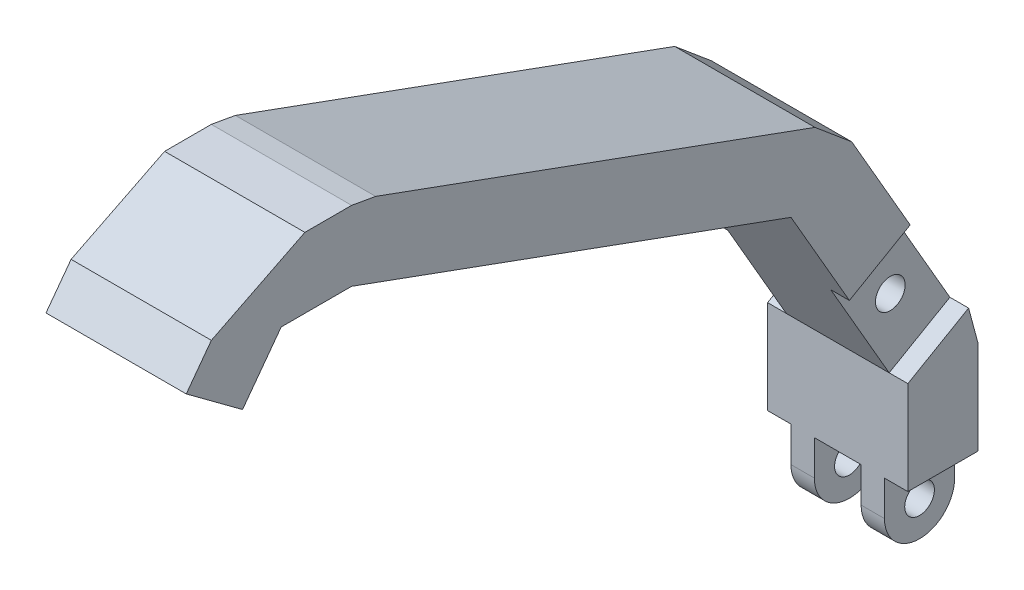
ISO-10303-21;
HEADER;
FILE_DESCRIPTION(('STEP AP214'),'2;1');
FILE_NAME('part.step','',(''),(''),'','','');
FILE_SCHEMA(('AUTOMOTIVE_DESIGN { 1 0 10303 214 1 1 1 1 }'));
ENDSEC;
DATA;
#1=APPLICATION_CONTEXT('core data for automotive mechanical design processes');
#2=APPLICATION_PROTOCOL_DEFINITION('international standard','automotive_design',2000,#1);
#3=PRODUCT_CONTEXT('',#1,'mechanical');
#4=PRODUCT('Part','Part','',(#3));
#5=PRODUCT_RELATED_PRODUCT_CATEGORY('part','',(#4));
#6=PRODUCT_DEFINITION_FORMATION('','',#4);
#7=PRODUCT_DEFINITION_CONTEXT('part definition',#1,'design');
#8=PRODUCT_DEFINITION('design','',#6,#7);
#9=PRODUCT_DEFINITION_SHAPE('','',#8);
#10=(LENGTH_UNIT() NAMED_UNIT(*) SI_UNIT(.MILLI.,.METRE.));
#11=(NAMED_UNIT(*) PLANE_ANGLE_UNIT() SI_UNIT($,.RADIAN.));
#12=(NAMED_UNIT(*) SI_UNIT($,.STERADIAN.) SOLID_ANGLE_UNIT());
#13=UNCERTAINTY_MEASURE_WITH_UNIT(LENGTH_MEASURE(1.E-05),#10,'distance_accuracy_value','');
#14=(GEOMETRIC_REPRESENTATION_CONTEXT(3) GLOBAL_UNCERTAINTY_ASSIGNED_CONTEXT((#13)) GLOBAL_UNIT_ASSIGNED_CONTEXT((#10,
#11,#12)) REPRESENTATION_CONTEXT('',''));
#15=CARTESIAN_POINT('',(0.,0.,0.));
#16=DIRECTION('',(0.,0.,1.));
#17=DIRECTION('',(1.,0.,0.));
#18=AXIS2_PLACEMENT_3D('',#15,#16,#17);
#19=CARTESIAN_POINT('',(0.,0.,-20.));
#20=DIRECTION('',(1.,0.,0.));
#21=DIRECTION('',(0.,0.,-1.));
#22=AXIS2_PLACEMENT_3D('',#19,#20,#21);
#23=PLANE('',#22);
#24=DIRECTION('',(0.,1.,0.));
#25=VECTOR('',#24,1.);
#26=CARTESIAN_POINT('',(0.,-97.503284521789,-148.969262078591));
#27=LINE('',#26,#25);
#28=CARTESIAN_POINT('',(0.,-97.503284521789,-148.969262078591));
#29=VERTEX_POINT('',#28);
#30=CARTESIAN_POINT('',(0.,-77.503284521789,-148.969262078591));
#31=VERTEX_POINT('',#30);
#32=EDGE_CURVE('E448',#29,#31,#27,.T.);
#33=ORIENTED_EDGE('',*,*,#32,.T.);
#34=DIRECTION('',(0.,0.499999999999998,-0.86602540378444));
#35=VECTOR('',#34,1.);
#36=CARTESIAN_POINT('',(0.,-150.758878018647,-22.0868522034198));
#37=LINE('',#36,#35);
#38=CARTESIAN_POINT('',(0.,-70.003284521789,-161.959643135357));
#39=VERTEX_POINT('',#38);
#40=EDGE_CURVE('E342',#31,#39,#37,.T.);
#41=ORIENTED_EDGE('',*,*,#40,.T.);
#42=DIRECTION('',(0.,-0.965925826289068,-0.258819045102521));
#43=VECTOR('',#42,1.);
#44=CARTESIAN_POINT('',(0.,-70.003284521789,-161.959643135357));
#45=LINE('',#44,#43);
#46=CARTESIAN_POINT('',(0.,-77.503284521789,-163.969262078591));
#47=VERTEX_POINT('',#46);
#48=EDGE_CURVE('E449',#39,#47,#45,.T.);
#49=ORIENTED_EDGE('',*,*,#48,.T.);
#50=DIRECTION('',(0.,1.,0.));
#51=VECTOR('',#50,1.);
#52=CARTESIAN_POINT('',(0.,-97.503284521789,-163.969262078591));
#53=LINE('',#52,#51);
#54=CARTESIAN_POINT('',(0.,-97.503284521789,-163.969262078591));
#55=VERTEX_POINT('',#54);
#56=EDGE_CURVE('E443',#55,#47,#53,.T.);
#57=ORIENTED_EDGE('',*,*,#56,.F.);
#58=DIRECTION('',(0.,0.,-1.));
#59=VECTOR('',#58,1.);
#60=CARTESIAN_POINT('',(0.,-97.503284521789,-148.969262078591));
#61=LINE('',#60,#59);
#62=EDGE_CURVE('E433',#29,#55,#61,.T.);
#63=ORIENTED_EDGE('',*,*,#62,.F.);
#64=EDGE_LOOP('',(#33,#41,#49,#57,#63));
#65=FACE_BOUND('',#64,.T.);
#66=ADVANCED_FACE('F92',(#65),#23,.F.);
#67=CARTESIAN_POINT('',(30.,0.,-20.));
#68=DIRECTION('',(-1.,0.,0.));
#69=DIRECTION('',(0.,0.,1.));
#70=AXIS2_PLACEMENT_3D('',#67,#68,#69);
#71=PLANE('',#70);
#72=DIRECTION('',(0.,0.86602540378444,0.499999999999998));
#73=VECTOR('',#72,1.);
#74=CARTESIAN_POINT('',(30.,-77.503284521789,-148.969262078591));
#75=LINE('',#74,#73);
#76=CARTESIAN_POINT('',(30.,-55.852649427178,-136.469262078591));
#77=VERTEX_POINT('',#76);
#78=CARTESIAN_POINT('',(30.,-34.202014332567,-123.969262078591));
#79=VERTEX_POINT('',#78);
#80=EDGE_CURVE('E465',#77,#79,#75,.T.);
#81=ORIENTED_EDGE('',*,*,#80,.F.);
#82=DIRECTION('',(0.,0.499999999999998,-0.86602540378444));
#83=VECTOR('',#82,1.);
#84=CARTESIAN_POINT('',(30.,-129.108242924036,-9.58685220341982));
#85=LINE('',#84,#83);
#86=CARTESIAN_POINT('',(30.,-48.352649427178,-149.459643135357));
#87=VERTEX_POINT('',#86);
#88=EDGE_CURVE('E333',#77,#87,#85,.T.);
#89=ORIENTED_EDGE('',*,*,#88,.T.);
#90=DIRECTION('',(0.,0.86602540378444,0.499999999999998));
#91=VECTOR('',#90,1.);
#92=CARTESIAN_POINT('',(30.,-70.003284521789,-161.959643135357));
#93=LINE('',#92,#91);
#94=CARTESIAN_POINT('',(30.,-26.702014332567,-136.959643135357));
#95=VERTEX_POINT('',#94);
#96=EDGE_CURVE('E461',#87,#95,#93,.T.);
#97=ORIENTED_EDGE('',*,*,#96,.T.);
#98=DIRECTION('',(0.,-0.64278760968654,-0.766044443118978));
#99=VECTOR('',#98,1.);
#100=CARTESIAN_POINT('',(30.,-20.1066250207783,-129.099564228476));
#101=LINE('',#100,#99);
#102=CARTESIAN_POINT('',(30.,-20.1066250207783,-129.099564228476));
#103=VERTEX_POINT('',#102);
#104=EDGE_CURVE('E469',#103,#95,#101,.T.);
#105=ORIENTED_EDGE('',*,*,#104,.F.);
#106=DIRECTION('',(0.,0.342020143325669,0.939692620785908));
#107=VECTOR('',#106,1.);
#108=CARTESIAN_POINT('',(30.,-20.1066250207783,-129.099564228476));
#109=LINE('',#108,#107);
#110=CARTESIAN_POINT('',(30.,14.0953893117886,-35.130302149885));
#111=VERTEX_POINT('',#110);
#112=EDGE_CURVE('E685',#103,#111,#109,.T.);
#113=ORIENTED_EDGE('',*,*,#112,.T.);
#114=DIRECTION('',(0.,-0.173648177666931,-0.984807753012208));
#115=VECTOR('',#114,1.);
#116=CARTESIAN_POINT('',(30.,15.,-30.));
#117=LINE('',#116,#115);
#118=CARTESIAN_POINT('',(30.,15.,-30.));
#119=VERTEX_POINT('',#118);
#120=EDGE_CURVE('E486',#119,#111,#117,.T.);
#121=ORIENTED_EDGE('',*,*,#120,.F.);
#122=DIRECTION('',(0.,0.,-1.));
#123=VECTOR('',#122,1.);
#124=CARTESIAN_POINT('',(30.,15.,-20.));
#125=LINE('',#124,#123);
#126=CARTESIAN_POINT('',(30.,15.,-20.));
#127=VERTEX_POINT('',#126);
#128=EDGE_CURVE('E516',#127,#119,#125,.T.);
#129=ORIENTED_EDGE('',*,*,#128,.F.);
#130=DIRECTION('',(0.,0.447213595499958,-0.894427190999916));
#131=VECTOR('',#130,1.);
#132=CARTESIAN_POINT('',(30.,10.,-10.));
#133=LINE('',#132,#131);
#134=CARTESIAN_POINT('',(30.,5.,0.));
#135=VERTEX_POINT('',#134);
#136=EDGE_CURVE('E303',#135,#127,#133,.T.);
#137=ORIENTED_EDGE('',*,*,#136,.F.);
#138=DIRECTION('',(0.,-0.803649179325779,0.595103349485618));
#139=VECTOR('',#138,1.);
#140=CARTESIAN_POINT('',(30.,50.5288673287577,-33.7141903988017));
#141=LINE('',#140,#139);
#142=CARTESIAN_POINT('',(30.,-2.24750591378389,5.36678833956879));
#143=VERTEX_POINT('',#142);
#144=EDGE_CURVE('E299',#135,#143,#141,.T.);
#145=ORIENTED_EDGE('',*,*,#144,.T.);
#146=DIRECTION('',(0.,0.595103349485618,0.803649179325779));
#147=VECTOR('',#146,1.);
#148=CARTESIAN_POINT('',(30.,-11.1594860904563,-6.66827340448126));
#149=LINE('',#148,#147);
#150=CARTESIAN_POINT('',(30.,-11.1594860904563,-6.66827340448126));
#151=VERTEX_POINT('',#150);
#152=EDGE_CURVE('E287',#151,#143,#149,.T.);
#153=ORIENTED_EDGE('',*,*,#152,.F.);
#154=DIRECTION('',(0.,-0.803649179325779,0.595103349485618));
#155=VECTOR('',#154,1.);
#156=CARTESIAN_POINT('',(30.,41.6168871520852,-45.7492521428517));
#157=LINE('',#156,#155);
#158=CARTESIAN_POINT('',(30.,0.,-14.9318885761414));
#159=VERTEX_POINT('',#158);
#160=EDGE_CURVE('E320',#159,#151,#157,.T.);
#161=ORIENTED_EDGE('',*,*,#160,.F.);
#162=DIRECTION('',(0.,0.,-1.));
#163=VECTOR('',#162,1.);
#164=CARTESIAN_POINT('',(30.,0.,-20.));
#165=LINE('',#164,#163);
#166=CARTESIAN_POINT('',(30.,0.,-30.));
#167=VERTEX_POINT('',#166);
#168=EDGE_CURVE('E101',#159,#167,#165,.T.);
#169=ORIENTED_EDGE('',*,*,#168,.T.);
#170=DIRECTION('',(0.,0.342020143325669,0.939692620785908));
#171=VECTOR('',#170,1.);
#172=CARTESIAN_POINT('',(30.,-34.2020143325669,-123.969262078591));
#173=LINE('',#172,#171);
#174=EDGE_CURVE('E495',#79,#167,#173,.T.);
#175=ORIENTED_EDGE('',*,*,#174,.F.);
#176=EDGE_LOOP('',(#81,#89,#97,#105,#113,#121,#129,#137,#145,#153,#161,#169,#175));
#177=FACE_BOUND('',#176,.T.);
#178=ADVANCED_FACE('F301',(#177),#71,.F.);
#179=CARTESIAN_POINT('',(0.,-97.5032845217887,1.96700590115615E-13));
#180=DIRECTION('',(0.,1.,0.));
#181=DIRECTION('',(0.,0.,1.));
#182=AXIS2_PLACEMENT_3D('',#179,#180,#181);
#183=PLANE('',#182);
#184=DIRECTION('',(0.,0.,-1.));
#185=VECTOR('',#184,1.);
#186=CARTESIAN_POINT('',(20.,-97.503284521789,-163.969262078591));
#187=LINE('',#186,#185);
#188=CARTESIAN_POINT('',(20.,-97.503284521789,-148.969262078591));
#189=VERTEX_POINT('',#188);
#190=CARTESIAN_POINT('',(20.,-97.503284521789,-163.969262078591));
#191=VERTEX_POINT('',#190);
#192=EDGE_CURVE('E379',#189,#191,#187,.T.);
#193=ORIENTED_EDGE('',*,*,#192,.F.);
#194=DIRECTION('',(-1.,0.,0.));
#195=VECTOR('',#194,1.);
#196=CARTESIAN_POINT('',(30.,-97.503284521789,-148.969262078591));
#197=LINE('',#196,#195);
#198=CARTESIAN_POINT('',(10.,-97.503284521789,-148.969262078591));
#199=VERTEX_POINT('',#198);
#200=EDGE_CURVE('E434',#189,#199,#197,.T.);
#201=ORIENTED_EDGE('',*,*,#200,.T.);
#202=DIRECTION('',(0.,0.,1.));
#203=VECTOR('',#202,1.);
#204=CARTESIAN_POINT('',(10.,-97.503284521789,-163.969262078591));
#205=LINE('',#204,#203);
#206=CARTESIAN_POINT('',(10.,-97.503284521789,-163.969262078591));
#207=VERTEX_POINT('',#206);
#208=EDGE_CURVE('E408',#207,#199,#205,.T.);
#209=ORIENTED_EDGE('',*,*,#208,.F.);
#210=DIRECTION('',(1.,0.,0.));
#211=VECTOR('',#210,1.);
#212=CARTESIAN_POINT('',(30.,-97.503284521789,-163.969262078591));
#213=LINE('',#212,#211);
#214=EDGE_CURVE('E440',#207,#191,#213,.T.);
#215=ORIENTED_EDGE('',*,*,#214,.T.);
#216=EDGE_LOOP('',(#193,#201,#209,#215));
#217=FACE_BOUND('',#216,.T.);
#218=ADVANCED_FACE('F628',(#217),#183,.F.);
#219=DIRECTION('',(0.,0.,1.));
#220=VECTOR('',#219,1.);
#221=CARTESIAN_POINT('',(25.,-97.503284521789,-163.969262078591));
#222=LINE('',#221,#220);
#223=CARTESIAN_POINT('',(25.,-97.503284521789,-163.969262078591));
#224=VERTEX_POINT('',#223);
#225=CARTESIAN_POINT('',(25.,-97.503284521789,-148.969262078591));
#226=VERTEX_POINT('',#225);
#227=EDGE_CURVE('E384',#224,#226,#222,.T.);
#228=ORIENTED_EDGE('',*,*,#227,.F.);
#229=CARTESIAN_POINT('',(30.,-97.503284521789,-163.969262078591));
#230=VERTEX_POINT('',#229);
#231=EDGE_CURVE('E436',#224,#230,#213,.T.);
#232=ORIENTED_EDGE('',*,*,#231,.T.);
#233=DIRECTION('',(0.,0.,1.));
#234=VECTOR('',#233,1.);
#235=CARTESIAN_POINT('',(30.,-97.503284521789,-148.969262078591));
#236=LINE('',#235,#234);
#237=CARTESIAN_POINT('',(30.,-97.503284521789,-148.969262078591));
#238=VERTEX_POINT('',#237);
#239=EDGE_CURVE('E427',#230,#238,#236,.T.);
#240=ORIENTED_EDGE('',*,*,#239,.T.);
#241=EDGE_CURVE('E431',#238,#226,#197,.T.);
#242=ORIENTED_EDGE('',*,*,#241,.T.);
#243=EDGE_LOOP('',(#228,#232,#240,#242));
#244=FACE_BOUND('',#243,.T.);
#245=ADVANCED_FACE('F615',(#244),#183,.F.);
#246=DIRECTION('',(0.,0.,-1.));
#247=VECTOR('',#246,1.);
#248=CARTESIAN_POINT('',(5.,-97.503284521789,-163.969262078591));
#249=LINE('',#248,#247);
#250=CARTESIAN_POINT('',(5.,-97.503284521789,-148.969262078591));
#251=VERTEX_POINT('',#250);
#252=CARTESIAN_POINT('',(5.,-97.503284521789,-163.969262078591));
#253=VERTEX_POINT('',#252);
#254=EDGE_CURVE('E403',#251,#253,#249,.T.);
#255=ORIENTED_EDGE('',*,*,#254,.F.);
#256=EDGE_CURVE('E430',#251,#29,#197,.T.);
#257=ORIENTED_EDGE('',*,*,#256,.T.);
#258=ORIENTED_EDGE('',*,*,#62,.T.);
#259=EDGE_CURVE('E437',#55,#253,#213,.T.);
#260=ORIENTED_EDGE('',*,*,#259,.T.);
#261=EDGE_LOOP('',(#255,#257,#258,#260));
#262=FACE_BOUND('',#261,.T.);
#263=ADVANCED_FACE('F631',(#262),#183,.F.);
#264=DIRECTION('',(0.,-0.803649179325779,0.595103349485618));
#265=VECTOR('',#264,1.);
#266=CARTESIAN_POINT('',(0.,50.5288673287577,-33.7141903988017));
#267=LINE('',#266,#265);
#268=CARTESIAN_POINT('',(0.,4.99999999999999,0.));
#269=VERTEX_POINT('',#268);
#270=CARTESIAN_POINT('',(0.,-2.24750591378389,5.36678833956879));
#271=VERTEX_POINT('',#270);
#272=EDGE_CURVE('E307',#269,#271,#267,.T.);
#273=ORIENTED_EDGE('',*,*,#272,.F.);
#274=DIRECTION('',(0.,0.447213595499958,-0.894427190999916));
#275=VECTOR('',#274,1.);
#276=CARTESIAN_POINT('',(0.,10.,-10.));
#277=LINE('',#276,#275);
#278=CARTESIAN_POINT('',(0.,15.,-20.));
#279=VERTEX_POINT('',#278);
#280=EDGE_CURVE('E485',#269,#279,#277,.T.);
#281=ORIENTED_EDGE('',*,*,#280,.T.);
#282=DIRECTION('',(0.,0.,-1.));
#283=VECTOR('',#282,1.);
#284=CARTESIAN_POINT('',(0.,15.,-20.));
#285=LINE('',#284,#283);
#286=CARTESIAN_POINT('',(0.,15.,-30.));
#287=VERTEX_POINT('',#286);
#288=EDGE_CURVE('E507',#279,#287,#285,.T.);
#289=ORIENTED_EDGE('',*,*,#288,.T.);
#290=DIRECTION('',(0.,-0.173648177666931,-0.984807753012208));
#291=VECTOR('',#290,1.);
#292=CARTESIAN_POINT('',(0.,15.,-30.));
#293=LINE('',#292,#291);
#294=CARTESIAN_POINT('',(0.,14.0953893117886,-35.130302149885));
#295=VERTEX_POINT('',#294);
#296=EDGE_CURVE('E482',#287,#295,#293,.T.);
#297=ORIENTED_EDGE('',*,*,#296,.T.);
#298=DIRECTION('',(0.,0.342020143325669,0.939692620785908));
#299=VECTOR('',#298,1.);
#300=CARTESIAN_POINT('',(0.,-20.1066250207783,-129.099564228476));
#301=LINE('',#300,#299);
#302=CARTESIAN_POINT('',(0.,-20.1066250207783,-129.099564228476));
#303=VERTEX_POINT('',#302);
#304=EDGE_CURVE('E688',#303,#295,#301,.T.);
#305=ORIENTED_EDGE('',*,*,#304,.F.);
#306=DIRECTION('',(0.,-0.64278760968654,-0.766044443118977));
#307=VECTOR('',#306,1.);
#308=CARTESIAN_POINT('',(0.,-20.1066250207783,-129.099564228476));
#309=LINE('',#308,#307);
#310=CARTESIAN_POINT('',(0.,-26.702014332567,-136.959643135357));
#311=VERTEX_POINT('',#310);
#312=EDGE_CURVE('E473',#303,#311,#309,.T.);
#313=ORIENTED_EDGE('',*,*,#312,.T.);
#314=DIRECTION('',(0.,0.86602540378444,0.499999999999998));
#315=VECTOR('',#314,1.);
#316=CARTESIAN_POINT('',(0.,-70.003284521789,-161.959643135357));
#317=LINE('',#316,#315);
#318=CARTESIAN_POINT('',(0.,-48.352649427178,-149.459643135357));
#319=VERTEX_POINT('',#318);
#320=EDGE_CURVE('E463',#319,#311,#317,.T.);
#321=ORIENTED_EDGE('',*,*,#320,.F.);
#322=DIRECTION('',(0.,0.499999999999998,-0.86602540378444));
#323=VECTOR('',#322,1.);
#324=CARTESIAN_POINT('',(0.,-129.108242924036,-9.58685220341982));
#325=LINE('',#324,#323);
#326=CARTESIAN_POINT('',(0.,-55.852649427178,-136.469262078591));
#327=VERTEX_POINT('',#326);
#328=EDGE_CURVE('E336',#327,#319,#325,.T.);
#329=ORIENTED_EDGE('',*,*,#328,.F.);
#330=DIRECTION('',(0.,0.86602540378444,0.499999999999998));
#331=VECTOR('',#330,1.);
#332=CARTESIAN_POINT('',(0.,-77.503284521789,-148.969262078591));
#333=LINE('',#332,#331);
#334=CARTESIAN_POINT('',(0.,-34.2020143325669,-123.969262078591));
#335=VERTEX_POINT('',#334);
#336=EDGE_CURVE('E468',#327,#335,#333,.T.);
#337=ORIENTED_EDGE('',*,*,#336,.T.);
#338=DIRECTION('',(0.,0.342020143325669,0.939692620785908));
#339=VECTOR('',#338,1.);
#340=CARTESIAN_POINT('',(0.,-34.2020143325669,-123.969262078591));
#341=LINE('',#340,#339);
#342=CARTESIAN_POINT('',(0.,0.,-30.));
#343=VERTEX_POINT('',#342);
#344=EDGE_CURVE('E694',#335,#343,#341,.T.);
#345=ORIENTED_EDGE('',*,*,#344,.T.);
#346=DIRECTION('',(0.,0.,-1.));
#347=VECTOR('',#346,1.);
#348=CARTESIAN_POINT('',(0.,0.,-20.));
#349=LINE('',#348,#347);
#350=CARTESIAN_POINT('',(0.,0.,-14.9318885761414));
#351=VERTEX_POINT('',#350);
#352=EDGE_CURVE('E13',#351,#343,#349,.T.);
#353=ORIENTED_EDGE('',*,*,#352,.F.);
#354=DIRECTION('',(0.,-0.803649179325779,0.595103349485618));
#355=VECTOR('',#354,1.);
#356=CARTESIAN_POINT('',(0.,41.6168871520852,-45.7492521428517));
#357=LINE('',#356,#355);
#358=CARTESIAN_POINT('',(0.,-11.1594860904563,-6.66827340448126));
#359=VERTEX_POINT('',#358);
#360=EDGE_CURVE('E318',#351,#359,#357,.T.);
#361=ORIENTED_EDGE('',*,*,#360,.T.);
#362=DIRECTION('',(0.,-0.595103349485618,-0.803649179325779));
#363=VECTOR('',#362,1.);
#364=CARTESIAN_POINT('',(0.,-4.01824589662889,2.97551674742809));
#365=LINE('',#364,#363);
#366=EDGE_CURVE('E306',#271,#359,#365,.T.);
#367=ORIENTED_EDGE('',*,*,#366,.F.);
#368=EDGE_LOOP('',(#273,#281,#289,#297,#305,#313,#321,#329,#337,#345,#353,#361,#367));
#369=FACE_BOUND('',#368,.T.);
#370=ADVANCED_FACE('F94',(#369),#23,.F.);
#371=CARTESIAN_POINT('',(0.,0.,-20.));
#372=DIRECTION('',(0.,1.,0.));
#373=DIRECTION('',(0.,0.,1.));
#374=AXIS2_PLACEMENT_3D('',#371,#372,#373);
#375=PLANE('',#374);
#376=ORIENTED_EDGE('',*,*,#168,.F.);
#377=DIRECTION('',(1.,0.,0.));
#378=VECTOR('',#377,1.);
#379=CARTESIAN_POINT('',(30.,0.,-14.9318885761414));
#380=LINE('',#379,#378);
#381=EDGE_CURVE('E107',#351,#159,#380,.T.);
#382=ORIENTED_EDGE('',*,*,#381,.F.);
#383=ORIENTED_EDGE('',*,*,#352,.T.);
#384=DIRECTION('',(1.,0.,0.));
#385=VECTOR('',#384,1.);
#386=CARTESIAN_POINT('',(0.,0.,-30.));
#387=LINE('',#386,#385);
#388=EDGE_CURVE('E500',#343,#167,#387,.T.);
#389=ORIENTED_EDGE('',*,*,#388,.T.);
#390=EDGE_LOOP('',(#376,#382,#383,#389));
#391=FACE_BOUND('',#390,.T.);
#392=ADVANCED_FACE('F659',(#391),#375,.F.);
#393=DIRECTION('',(0.,-0.965925826289068,-0.258819045102521));
#394=VECTOR('',#393,1.);
#395=CARTESIAN_POINT('',(30.,-70.003284521789,-161.959643135357));
#396=LINE('',#395,#394);
#397=CARTESIAN_POINT('',(30.,-70.003284521789,-161.959643135357));
#398=VERTEX_POINT('',#397);
#399=CARTESIAN_POINT('',(30.,-77.503284521789,-163.969262078591));
#400=VERTEX_POINT('',#399);
#401=EDGE_CURVE('E452',#398,#400,#396,.T.);
#402=ORIENTED_EDGE('',*,*,#401,.F.);
#403=DIRECTION('',(0.,0.499999999999998,-0.86602540378444));
#404=VECTOR('',#403,1.);
#405=CARTESIAN_POINT('',(30.,-150.758878018647,-22.0868522034198));
#406=LINE('',#405,#404);
#407=CARTESIAN_POINT('',(30.,-77.503284521789,-148.969262078591));
#408=VERTEX_POINT('',#407);
#409=EDGE_CURVE('E582',#408,#398,#406,.T.);
#410=ORIENTED_EDGE('',*,*,#409,.F.);
#411=DIRECTION('',(0.,1.,0.));
#412=VECTOR('',#411,1.);
#413=CARTESIAN_POINT('',(30.,-97.503284521789,-148.969262078591));
#414=LINE('',#413,#412);
#415=EDGE_CURVE('E444',#238,#408,#414,.T.);
#416=ORIENTED_EDGE('',*,*,#415,.F.);
#417=ORIENTED_EDGE('',*,*,#239,.F.);
#418=DIRECTION('',(0.,1.,0.));
#419=VECTOR('',#418,1.);
#420=CARTESIAN_POINT('',(30.,-97.503284521789,-163.969262078591));
#421=LINE('',#420,#419);
#422=EDGE_CURVE('E439',#230,#400,#421,.T.);
#423=ORIENTED_EDGE('',*,*,#422,.T.);
#424=EDGE_LOOP('',(#402,#410,#416,#417,#423));
#425=FACE_BOUND('',#424,.T.);
#426=ADVANCED_FACE('F609',(#425),#71,.F.);
#427=CARTESIAN_POINT('',(0.,15.,-20.));
#428=DIRECTION('',(0.,-1.,0.));
#429=DIRECTION('',(0.,0.,-1.));
#430=AXIS2_PLACEMENT_3D('',#427,#428,#429);
#431=PLANE('',#430);
#432=DIRECTION('',(-1.,0.,0.));
#433=VECTOR('',#432,1.);
#434=CARTESIAN_POINT('',(0.,15.,-30.));
#435=LINE('',#434,#433);
#436=EDGE_CURVE('E508',#119,#287,#435,.T.);
#437=ORIENTED_EDGE('',*,*,#436,.T.);
#438=ORIENTED_EDGE('',*,*,#288,.F.);
#439=DIRECTION('',(-1.,0.,0.));
#440=VECTOR('',#439,1.);
#441=CARTESIAN_POINT('',(0.,15.,-20.));
#442=LINE('',#441,#440);
#443=EDGE_CURVE('E504',#127,#279,#442,.T.);
#444=ORIENTED_EDGE('',*,*,#443,.F.);
#445=ORIENTED_EDGE('',*,*,#128,.T.);
#446=EDGE_LOOP('',(#437,#438,#444,#445));
#447=FACE_BOUND('',#446,.T.);
#448=ADVANCED_FACE('F675',(#447),#431,.F.);
#449=CARTESIAN_POINT('',(0.,5.,0.));
#450=DIRECTION('',(0.,0.894427190999916,0.447213595499958));
#451=DIRECTION('',(1.,0.,0.));
#452=AXIS2_PLACEMENT_3D('',#449,#450,#451);
#453=PLANE('',#452);
#454=DIRECTION('',(1.,0.,0.));
#455=VECTOR('',#454,1.);
#456=CARTESIAN_POINT('',(15.,5.,0.));
#457=LINE('',#456,#455);
#458=EDGE_CURVE('E498',#269,#135,#457,.T.);
#459=ORIENTED_EDGE('',*,*,#458,.T.);
#460=ORIENTED_EDGE('',*,*,#136,.T.);
#461=ORIENTED_EDGE('',*,*,#443,.T.);
#462=ORIENTED_EDGE('',*,*,#280,.F.);
#463=EDGE_LOOP('',(#459,#460,#461,#462));
#464=FACE_BOUND('',#463,.T.);
#465=ADVANCED_FACE('F670',(#464),#453,.T.);
#466=CARTESIAN_POINT('',(0.,15.,-30.));
#467=DIRECTION('',(0.,-0.984807753012208,0.173648177666931));
#468=DIRECTION('',(0.,-0.173648177666931,-0.984807753012208));
#469=AXIS2_PLACEMENT_3D('',#466,#467,#468);
#470=PLANE('',#469);
#471=ORIENTED_EDGE('',*,*,#120,.T.);
#472=DIRECTION('',(1.,0.,0.));
#473=VECTOR('',#472,1.);
#474=CARTESIAN_POINT('',(0.,14.0953893117886,-35.130302149885));
#475=LINE('',#474,#473);
#476=EDGE_CURVE('E490',#295,#111,#475,.T.);
#477=ORIENTED_EDGE('',*,*,#476,.F.);
#478=ORIENTED_EDGE('',*,*,#296,.F.);
#479=ORIENTED_EDGE('',*,*,#436,.F.);
#480=EDGE_LOOP('',(#471,#477,#478,#479));
#481=FACE_BOUND('',#480,.T.);
#482=ADVANCED_FACE('F717',(#481),#470,.F.);
#483=CARTESIAN_POINT('',(30.,-34.2020143325669,-123.969262078591));
#484=DIRECTION('',(0.,-0.939692620785908,0.342020143325669));
#485=DIRECTION('',(0.,-0.342020143325669,-0.939692620785908));
#486=AXIS2_PLACEMENT_3D('',#483,#484,#485);
#487=PLANE('',#486);
#488=DIRECTION('',(1.,0.,0.));
#489=VECTOR('',#488,1.);
#490=CARTESIAN_POINT('',(30.,-34.2020143325669,-123.969262078591));
#491=LINE('',#490,#489);
#492=EDGE_CURVE('E689',#335,#79,#491,.T.);
#493=ORIENTED_EDGE('',*,*,#492,.T.);
#494=ORIENTED_EDGE('',*,*,#174,.T.);
#495=ORIENTED_EDGE('',*,*,#388,.F.);
#496=ORIENTED_EDGE('',*,*,#344,.F.);
#497=EDGE_LOOP('',(#493,#494,#495,#496));
#498=FACE_BOUND('',#497,.T.);
#499=ADVANCED_FACE('F729',(#498),#487,.T.);
#500=CARTESIAN_POINT('',(30.,-20.1066250207783,-129.099564228476));
#501=DIRECTION('',(0.,0.939692620785908,-0.342020143325669));
#502=DIRECTION('',(0.,0.342020143325669,0.939692620785908));
#503=AXIS2_PLACEMENT_3D('',#500,#501,#502);
#504=PLANE('',#503);
#505=DIRECTION('',(-1.,0.,0.));
#506=VECTOR('',#505,1.);
#507=CARTESIAN_POINT('',(30.,-20.1066250207783,-129.099564228476));
#508=LINE('',#507,#506);
#509=EDGE_CURVE('E472',#103,#303,#508,.T.);
#510=ORIENTED_EDGE('',*,*,#509,.T.);
#511=ORIENTED_EDGE('',*,*,#304,.T.);
#512=ORIENTED_EDGE('',*,*,#476,.T.);
#513=ORIENTED_EDGE('',*,*,#112,.F.);
#514=EDGE_LOOP('',(#510,#511,#512,#513));
#515=FACE_BOUND('',#514,.T.);
#516=ADVANCED_FACE('F713',(#515),#504,.T.);
#517=CARTESIAN_POINT('',(0.,-20.1066250207783,-129.099564228476));
#518=DIRECTION('',(0.,-0.766044443118977,0.64278760968654));
#519=DIRECTION('',(0.,-0.64278760968654,-0.766044443118978));
#520=AXIS2_PLACEMENT_3D('',#517,#518,#519);
#521=PLANE('',#520);
#522=ORIENTED_EDGE('',*,*,#509,.F.);
#523=ORIENTED_EDGE('',*,*,#104,.T.);
#524=DIRECTION('',(1.,0.,0.));
#525=VECTOR('',#524,1.);
#526=CARTESIAN_POINT('',(0.,-26.702014332567,-136.959643135357));
#527=LINE('',#526,#525);
#528=EDGE_CURVE('E467',#311,#95,#527,.T.);
#529=ORIENTED_EDGE('',*,*,#528,.F.);
#530=ORIENTED_EDGE('',*,*,#312,.F.);
#531=EDGE_LOOP('',(#522,#523,#529,#530));
#532=FACE_BOUND('',#531,.T.);
#533=ADVANCED_FACE('F721',(#532),#521,.F.);
#534=CARTESIAN_POINT('',(30.,-77.503284521789,-148.969262078591));
#535=DIRECTION('',(0.,0.499999999999998,-0.86602540378444));
#536=DIRECTION('',(0.,0.86602540378444,0.499999999999998));
#537=AXIS2_PLACEMENT_3D('',#534,#535,#536);
#538=PLANE('',#537);
#539=DIRECTION('',(1.,0.,0.));
#540=VECTOR('',#539,1.);
#541=CARTESIAN_POINT('',(30.,-55.852649427178,-136.469262078591));
#542=LINE('',#541,#540);
#543=CARTESIAN_POINT('',(4.,-55.852649427178,-136.469262078591));
#544=VERTEX_POINT('',#543);
#545=EDGE_CURVE('E352',#327,#544,#542,.T.);
#546=ORIENTED_EDGE('',*,*,#545,.T.);
#547=DIRECTION('',(0.,-0.86602540378444,-0.499999999999998));
#548=VECTOR('',#547,1.);
#549=CARTESIAN_POINT('',(4.,-77.503284521789,-148.969262078591));
#550=LINE('',#549,#548);
#551=CARTESIAN_POINT('',(4.,-77.503284521789,-148.969262078591));
#552=VERTEX_POINT('',#551);
#553=EDGE_CURVE('E347',#544,#552,#550,.T.);
#554=ORIENTED_EDGE('',*,*,#553,.T.);
#555=DIRECTION('',(-1.,0.,0.));
#556=VECTOR('',#555,1.);
#557=CARTESIAN_POINT('',(30.,-77.503284521789,-148.969262078591));
#558=LINE('',#557,#556);
#559=CARTESIAN_POINT('',(26.,-77.503284521789,-148.969262078591));
#560=VERTEX_POINT('',#559);
#561=EDGE_CURVE('E539',#560,#552,#558,.T.);
#562=ORIENTED_EDGE('',*,*,#561,.F.);
#563=DIRECTION('',(0.,0.86602540378444,0.499999999999998));
#564=VECTOR('',#563,1.);
#565=CARTESIAN_POINT('',(26.,-77.503284521789,-148.969262078591));
#566=LINE('',#565,#564);
#567=CARTESIAN_POINT('',(26.,-55.852649427178,-136.469262078591));
#568=VERTEX_POINT('',#567);
#569=EDGE_CURVE('E346',#560,#568,#566,.T.);
#570=ORIENTED_EDGE('',*,*,#569,.T.);
#571=DIRECTION('',(1.,0.,0.));
#572=VECTOR('',#571,1.);
#573=CARTESIAN_POINT('',(30.,-55.852649427178,-136.469262078591));
#574=LINE('',#573,#572);
#575=EDGE_CURVE('E349',#568,#77,#574,.T.);
#576=ORIENTED_EDGE('',*,*,#575,.T.);
#577=ORIENTED_EDGE('',*,*,#80,.T.);
#578=ORIENTED_EDGE('',*,*,#492,.F.);
#579=ORIENTED_EDGE('',*,*,#336,.F.);
#580=EDGE_LOOP('',(#546,#554,#562,#570,#576,#577,#578,#579));
#581=FACE_BOUND('',#580,.T.);
#582=ADVANCED_FACE('F576',(#581),#538,.F.);
#583=CARTESIAN_POINT('',(30.,-70.003284521789,-161.959643135357));
#584=DIRECTION('',(0.,-0.499999999999998,0.86602540378444));
#585=DIRECTION('',(0.,-0.86602540378444,-0.499999999999998));
#586=AXIS2_PLACEMENT_3D('',#583,#584,#585);
#587=PLANE('',#586);
#588=DIRECTION('',(1.,0.,0.));
#589=VECTOR('',#588,1.);
#590=CARTESIAN_POINT('',(30.,-70.003284521789,-161.959643135357));
#591=LINE('',#590,#589);
#592=CARTESIAN_POINT('',(4.,-70.003284521789,-161.959643135357));
#593=VERTEX_POINT('',#592);
#594=CARTESIAN_POINT('',(26.,-70.003284521789,-161.959643135357));
#595=VERTEX_POINT('',#594);
#596=EDGE_CURVE('E529',#593,#595,#591,.T.);
#597=ORIENTED_EDGE('',*,*,#596,.F.);
#598=DIRECTION('',(0.,-0.86602540378444,-0.499999999999998));
#599=VECTOR('',#598,1.);
#600=CARTESIAN_POINT('',(4.,-70.003284521789,-161.959643135357));
#601=LINE('',#600,#599);
#602=CARTESIAN_POINT('',(4.,-48.352649427178,-149.459643135357));
#603=VERTEX_POINT('',#602);
#604=EDGE_CURVE('E332',#603,#593,#601,.T.);
#605=ORIENTED_EDGE('',*,*,#604,.F.);
#606=DIRECTION('',(1.,0.,0.));
#607=VECTOR('',#606,1.);
#608=CARTESIAN_POINT('',(0.,-48.352649427178,-149.459643135357));
#609=LINE('',#608,#607);
#610=EDGE_CURVE('E329',#319,#603,#609,.T.);
#611=ORIENTED_EDGE('',*,*,#610,.F.);
#612=ORIENTED_EDGE('',*,*,#320,.T.);
#613=ORIENTED_EDGE('',*,*,#528,.T.);
#614=ORIENTED_EDGE('',*,*,#96,.F.);
#615=DIRECTION('',(1.,0.,0.));
#616=VECTOR('',#615,1.);
#617=CARTESIAN_POINT('',(30.,-48.352649427178,-149.459643135357));
#618=LINE('',#617,#616);
#619=CARTESIAN_POINT('',(26.,-48.352649427178,-149.459643135357));
#620=VERTEX_POINT('',#619);
#621=EDGE_CURVE('E585',#620,#87,#618,.T.);
#622=ORIENTED_EDGE('',*,*,#621,.F.);
#623=DIRECTION('',(0.,0.86602540378444,0.499999999999998));
#624=VECTOR('',#623,1.);
#625=CARTESIAN_POINT('',(26.,-70.003284521789,-161.959643135357));
#626=LINE('',#625,#624);
#627=EDGE_CURVE('E592',#595,#620,#626,.T.);
#628=ORIENTED_EDGE('',*,*,#627,.F.);
#629=EDGE_LOOP('',(#597,#605,#611,#612,#613,#614,#622,#628));
#630=FACE_BOUND('',#629,.T.);
#631=ADVANCED_FACE('F604',(#630),#587,.F.);
#632=CARTESIAN_POINT('',(0.,-70.003284521789,-161.959643135357));
#633=DIRECTION('',(0.,-0.258819045102521,0.965925826289068));
#634=DIRECTION('',(0.,-0.965925826289068,-0.258819045102521));
#635=AXIS2_PLACEMENT_3D('',#632,#633,#634);
#636=PLANE('',#635);
#637=EDGE_CURVE('E464',#39,#593,#591,.T.);
#638=ORIENTED_EDGE('',*,*,#637,.T.);
#639=ORIENTED_EDGE('',*,*,#596,.T.);
#640=DIRECTION('',(-1.,0.,0.));
#641=VECTOR('',#640,1.);
#642=CARTESIAN_POINT('',(30.,-70.003284521789,-161.959643135357));
#643=LINE('',#642,#641);
#644=EDGE_CURVE('E328',#398,#595,#643,.T.);
#645=ORIENTED_EDGE('',*,*,#644,.F.);
#646=ORIENTED_EDGE('',*,*,#401,.T.);
#647=DIRECTION('',(1.,0.,0.));
#648=VECTOR('',#647,1.);
#649=CARTESIAN_POINT('',(0.,-77.503284521789,-163.969262078591));
#650=LINE('',#649,#648);
#651=EDGE_CURVE('E447',#47,#400,#650,.T.);
#652=ORIENTED_EDGE('',*,*,#651,.F.);
#653=ORIENTED_EDGE('',*,*,#48,.F.);
#654=EDGE_LOOP('',(#638,#639,#645,#646,#652,#653));
#655=FACE_BOUND('',#654,.T.);
#656=ADVANCED_FACE('F560',(#655),#636,.F.);
#657=CARTESIAN_POINT('',(30.,-97.503284521789,-148.969262078591));
#658=DIRECTION('',(0.,0.,-1.));
#659=DIRECTION('',(0.,1.,0.));
#660=AXIS2_PLACEMENT_3D('',#657,#658,#659);
#661=PLANE('',#660);
#662=EDGE_CURVE('E532',#408,#560,#558,.T.);
#663=ORIENTED_EDGE('',*,*,#662,.T.);
#664=ORIENTED_EDGE('',*,*,#561,.T.);
#665=EDGE_CURVE('E460',#552,#31,#558,.T.);
#666=ORIENTED_EDGE('',*,*,#665,.T.);
#667=ORIENTED_EDGE('',*,*,#32,.F.);
#668=ORIENTED_EDGE('',*,*,#256,.F.);
#669=DIRECTION('',(0.,1.,0.));
#670=VECTOR('',#669,1.);
#671=CARTESIAN_POINT('',(5.,-105.003284521789,-148.969262078591));
#672=LINE('',#671,#670);
#673=CARTESIAN_POINT('',(5.,-105.003284521789,-148.969262078591));
#674=VERTEX_POINT('',#673);
#675=EDGE_CURVE('E411',#674,#251,#672,.T.);
#676=ORIENTED_EDGE('',*,*,#675,.F.);
#677=DIRECTION('',(-1.,0.,0.));
#678=VECTOR('',#677,1.);
#679=CARTESIAN_POINT('',(5.,-105.003284521789,-148.969262078591));
#680=LINE('',#679,#678);
#681=CARTESIAN_POINT('',(10.,-105.003284521789,-148.969262078591));
#682=VERTEX_POINT('',#681);
#683=EDGE_CURVE('E407',#682,#674,#680,.T.);
#684=ORIENTED_EDGE('',*,*,#683,.F.);
#685=DIRECTION('',(0.,1.,0.));
#686=VECTOR('',#685,1.);
#687=CARTESIAN_POINT('',(10.,-105.003284521789,-148.969262078591));
#688=LINE('',#687,#686);
#689=EDGE_CURVE('E418',#682,#199,#688,.T.);
#690=ORIENTED_EDGE('',*,*,#689,.T.);
#691=ORIENTED_EDGE('',*,*,#200,.F.);
#692=DIRECTION('',(0.,1.,0.));
#693=VECTOR('',#692,1.);
#694=CARTESIAN_POINT('',(20.,-105.003284521789,-148.969262078591));
#695=LINE('',#694,#693);
#696=CARTESIAN_POINT('',(20.,-105.003284521789,-148.969262078591));
#697=VERTEX_POINT('',#696);
#698=EDGE_CURVE('E387',#697,#189,#695,.T.);
#699=ORIENTED_EDGE('',*,*,#698,.F.);
#700=DIRECTION('',(-1.,0.,0.));
#701=VECTOR('',#700,1.);
#702=CARTESIAN_POINT('',(20.,-105.003284521789,-148.969262078591));
#703=LINE('',#702,#701);
#704=CARTESIAN_POINT('',(25.,-105.003284521789,-148.969262078591));
#705=VERTEX_POINT('',#704);
#706=EDGE_CURVE('E383',#705,#697,#703,.T.);
#707=ORIENTED_EDGE('',*,*,#706,.F.);
#708=DIRECTION('',(0.,1.,0.));
#709=VECTOR('',#708,1.);
#710=CARTESIAN_POINT('',(25.,-105.003284521789,-148.969262078591));
#711=LINE('',#710,#709);
#712=EDGE_CURVE('E394',#705,#226,#711,.T.);
#713=ORIENTED_EDGE('',*,*,#712,.T.);
#714=ORIENTED_EDGE('',*,*,#241,.F.);
#715=ORIENTED_EDGE('',*,*,#415,.T.);
#716=EDGE_LOOP('',(#663,#664,#666,#667,#668,#676,#684,#690,#691,#699,#707,#713,#714,#715));
#717=FACE_BOUND('',#716,.T.);
#718=ADVANCED_FACE('F570',(#717),#661,.F.);
#719=CARTESIAN_POINT('',(30.,-97.503284521789,-163.969262078591));
#720=DIRECTION('',(0.,0.,1.));
#721=DIRECTION('',(0.,-1.,0.));
#722=AXIS2_PLACEMENT_3D('',#719,#720,#721);
#723=PLANE('',#722);
#724=ORIENTED_EDGE('',*,*,#651,.T.);
#725=ORIENTED_EDGE('',*,*,#422,.F.);
#726=ORIENTED_EDGE('',*,*,#231,.F.);
#727=DIRECTION('',(0.,1.,0.));
#728=VECTOR('',#727,1.);
#729=CARTESIAN_POINT('',(25.,-105.003284521789,-163.969262078591));
#730=LINE('',#729,#728);
#731=CARTESIAN_POINT('',(25.,-105.003284521789,-163.969262078591));
#732=VERTEX_POINT('',#731);
#733=EDGE_CURVE('E397',#732,#224,#730,.T.);
#734=ORIENTED_EDGE('',*,*,#733,.F.);
#735=DIRECTION('',(1.,0.,0.));
#736=VECTOR('',#735,1.);
#737=CARTESIAN_POINT('',(20.,-105.003284521789,-163.969262078591));
#738=LINE('',#737,#736);
#739=CARTESIAN_POINT('',(20.,-105.003284521789,-163.969262078591));
#740=VERTEX_POINT('',#739);
#741=EDGE_CURVE('E380',#740,#732,#738,.T.);
#742=ORIENTED_EDGE('',*,*,#741,.F.);
#743=DIRECTION('',(0.,1.,0.));
#744=VECTOR('',#743,1.);
#745=CARTESIAN_POINT('',(20.,-105.003284521789,-163.969262078591));
#746=LINE('',#745,#744);
#747=EDGE_CURVE('E400',#740,#191,#746,.T.);
#748=ORIENTED_EDGE('',*,*,#747,.T.);
#749=ORIENTED_EDGE('',*,*,#214,.F.);
#750=DIRECTION('',(0.,1.,0.));
#751=VECTOR('',#750,1.);
#752=CARTESIAN_POINT('',(10.,-105.003284521789,-163.969262078591));
#753=LINE('',#752,#751);
#754=CARTESIAN_POINT('',(10.,-105.003284521789,-163.969262078591));
#755=VERTEX_POINT('',#754);
#756=EDGE_CURVE('E421',#755,#207,#753,.T.);
#757=ORIENTED_EDGE('',*,*,#756,.F.);
#758=DIRECTION('',(1.,0.,0.));
#759=VECTOR('',#758,1.);
#760=CARTESIAN_POINT('',(5.,-105.003284521789,-163.969262078591));
#761=LINE('',#760,#759);
#762=CARTESIAN_POINT('',(5.,-105.003284521789,-163.969262078591));
#763=VERTEX_POINT('',#762);
#764=EDGE_CURVE('E404',#763,#755,#761,.T.);
#765=ORIENTED_EDGE('',*,*,#764,.F.);
#766=DIRECTION('',(0.,1.,0.));
#767=VECTOR('',#766,1.);
#768=CARTESIAN_POINT('',(5.,-105.003284521789,-163.969262078591));
#769=LINE('',#768,#767);
#770=EDGE_CURVE('E424',#763,#253,#769,.T.);
#771=ORIENTED_EDGE('',*,*,#770,.T.);
#772=ORIENTED_EDGE('',*,*,#259,.F.);
#773=ORIENTED_EDGE('',*,*,#56,.T.);
#774=EDGE_LOOP('',(#724,#725,#726,#734,#742,#748,#749,#757,#765,#771,#772,#773));
#775=FACE_BOUND('',#774,.T.);
#776=ADVANCED_FACE('F554',(#775),#723,.F.);
#777=CARTESIAN_POINT('',(5.,-105.003284521789,-163.969262078591));
#778=DIRECTION('',(1.,0.,0.));
#779=DIRECTION('',(0.,0.,-1.));
#780=AXIS2_PLACEMENT_3D('',#777,#778,#779);
#781=PLANE('',#780);
#782=CARTESIAN_POINT('',(5.,-105.003284521789,-156.469262078591));
#783=DIRECTION('',(-1.,0.,0.));
#784=DIRECTION('',(0.,0.,1.));
#785=AXIS2_PLACEMENT_3D('',#782,#783,#784);
#786=CIRCLE('',#785,3.175);
#787=CARTESIAN_POINT('',(5.,-105.003284521789,-153.294262078591));
#788=VERTEX_POINT('',#787);
#789=EDGE_CURVE('E355',#788,#788,#786,.T.);
#790=ORIENTED_EDGE('',*,*,#789,.F.);
#791=EDGE_LOOP('',(#790));
#792=FACE_BOUND('',#791,.T.);
#793=ORIENTED_EDGE('',*,*,#254,.T.);
#794=ORIENTED_EDGE('',*,*,#770,.F.);
#795=CARTESIAN_POINT('',(5.,-105.003284521789,-156.469262078591));
#796=DIRECTION('',(1.,0.,0.));
#797=DIRECTION('',(0.,0.,-1.));
#798=AXIS2_PLACEMENT_3D('',#795,#796,#797);
#799=CIRCLE('',#798,7.50000000000001);
#800=EDGE_CURVE('E367',#674,#763,#799,.T.);
#801=ORIENTED_EDGE('',*,*,#800,.F.);
#802=ORIENTED_EDGE('',*,*,#675,.T.);
#803=EDGE_LOOP('',(#793,#794,#801,#802));
#804=FACE_BOUND('',#803,.T.);
#805=ADVANCED_FACE('F634',(#792,#804),#781,.F.);
#806=CARTESIAN_POINT('',(10.,-105.003284521789,-163.969262078591));
#807=DIRECTION('',(-1.,0.,0.));
#808=DIRECTION('',(0.,0.,1.));
#809=AXIS2_PLACEMENT_3D('',#806,#807,#808);
#810=PLANE('',#809);
#811=CARTESIAN_POINT('',(10.,-105.003284521789,-156.469262078591));
#812=DIRECTION('',(-1.,0.,0.));
#813=DIRECTION('',(0.,0.,1.));
#814=AXIS2_PLACEMENT_3D('',#811,#812,#813);
#815=CIRCLE('',#814,3.175);
#816=CARTESIAN_POINT('',(10.,-105.003284521789,-153.294262078591));
#817=VERTEX_POINT('',#816);
#818=EDGE_CURVE('E364',#817,#817,#815,.T.);
#819=ORIENTED_EDGE('',*,*,#818,.T.);
#820=EDGE_LOOP('',(#819));
#821=FACE_BOUND('',#820,.T.);
#822=ORIENTED_EDGE('',*,*,#208,.T.);
#823=ORIENTED_EDGE('',*,*,#689,.F.);
#824=CARTESIAN_POINT('',(10.,-105.003284521789,-156.469262078591));
#825=DIRECTION('',(1.,0.,0.));
#826=DIRECTION('',(0.,0.,-1.));
#827=AXIS2_PLACEMENT_3D('',#824,#825,#826);
#828=CIRCLE('',#827,7.50000000000001);
#829=EDGE_CURVE('E370',#682,#755,#828,.T.);
#830=ORIENTED_EDGE('',*,*,#829,.T.);
#831=ORIENTED_EDGE('',*,*,#756,.T.);
#832=EDGE_LOOP('',(#822,#823,#830,#831));
#833=FACE_BOUND('',#832,.T.);
#834=ADVANCED_FACE('F640',(#821,#833),#810,.F.);
#835=CARTESIAN_POINT('',(20.,-105.003284521789,-163.969262078591));
#836=DIRECTION('',(1.,0.,0.));
#837=DIRECTION('',(0.,0.,-1.));
#838=AXIS2_PLACEMENT_3D('',#835,#836,#837);
#839=PLANE('',#838);
#840=CARTESIAN_POINT('',(20.,-105.003284521789,-156.469262078591));
#841=DIRECTION('',(1.,0.,0.));
#842=DIRECTION('',(0.,0.,-1.));
#843=AXIS2_PLACEMENT_3D('',#840,#841,#842);
#844=CIRCLE('',#843,3.175);
#845=CARTESIAN_POINT('',(20.,-105.003284521789,-159.644262078591));
#846=VERTEX_POINT('',#845);
#847=EDGE_CURVE('E361',#846,#846,#844,.T.);
#848=ORIENTED_EDGE('',*,*,#847,.T.);
#849=EDGE_LOOP('',(#848));
#850=FACE_BOUND('',#849,.T.);
#851=ORIENTED_EDGE('',*,*,#192,.T.);
#852=ORIENTED_EDGE('',*,*,#747,.F.);
#853=CARTESIAN_POINT('',(20.,-105.003284521789,-156.469262078591));
#854=DIRECTION('',(1.,0.,0.));
#855=DIRECTION('',(0.,0.,-1.));
#856=AXIS2_PLACEMENT_3D('',#853,#854,#855);
#857=CIRCLE('',#856,7.50000000000001);
#858=EDGE_CURVE('E373',#697,#740,#857,.T.);
#859=ORIENTED_EDGE('',*,*,#858,.F.);
#860=ORIENTED_EDGE('',*,*,#698,.T.);
#861=EDGE_LOOP('',(#851,#852,#859,#860));
#862=FACE_BOUND('',#861,.T.);
#863=ADVANCED_FACE('F625',(#850,#862),#839,.F.);
#864=CARTESIAN_POINT('',(25.,-105.003284521789,-163.969262078591));
#865=DIRECTION('',(-1.,0.,0.));
#866=DIRECTION('',(0.,0.,1.));
#867=AXIS2_PLACEMENT_3D('',#864,#865,#866);
#868=PLANE('',#867);
#869=CARTESIAN_POINT('',(25.,-105.003284521789,-156.469262078591));
#870=DIRECTION('',(-1.,0.,0.));
#871=DIRECTION('',(0.,0.,1.));
#872=AXIS2_PLACEMENT_3D('',#869,#870,#871);
#873=CIRCLE('',#872,3.175);
#874=CARTESIAN_POINT('',(25.,-105.003284521789,-153.294262078591));
#875=VERTEX_POINT('',#874);
#876=EDGE_CURVE('E358',#875,#875,#873,.F.);
#877=ORIENTED_EDGE('',*,*,#876,.F.);
#878=EDGE_LOOP('',(#877));
#879=FACE_BOUND('',#878,.T.);
#880=ORIENTED_EDGE('',*,*,#227,.T.);
#881=ORIENTED_EDGE('',*,*,#712,.F.);
#882=CARTESIAN_POINT('',(25.,-105.003284521789,-156.469262078591));
#883=DIRECTION('',(1.,0.,0.));
#884=DIRECTION('',(0.,0.,-1.));
#885=AXIS2_PLACEMENT_3D('',#882,#883,#884);
#886=CIRCLE('',#885,7.50000000000001);
#887=EDGE_CURVE('E376',#705,#732,#886,.T.);
#888=ORIENTED_EDGE('',*,*,#887,.T.);
#889=ORIENTED_EDGE('',*,*,#733,.T.);
#890=EDGE_LOOP('',(#880,#881,#888,#889));
#891=FACE_BOUND('',#890,.T.);
#892=ADVANCED_FACE('F617',(#879,#891),#868,.F.);
#893=CARTESIAN_POINT('',(25.,-105.003284521789,-156.469262078591));
#894=DIRECTION('',(1.,0.,0.));
#895=DIRECTION('',(0.,0.,-1.));
#896=AXIS2_PLACEMENT_3D('',#893,#894,#895);
#897=CYLINDRICAL_SURFACE('',#896,7.50000000000001);
#898=ORIENTED_EDGE('',*,*,#858,.T.);
#899=ORIENTED_EDGE('',*,*,#741,.T.);
#900=ORIENTED_EDGE('',*,*,#887,.F.);
#901=ORIENTED_EDGE('',*,*,#706,.T.);
#902=EDGE_LOOP('',(#898,#899,#900,#901));
#903=FACE_BOUND('',#902,.T.);
#904=ADVANCED_FACE('F621',(#903),#897,.T.);
#905=CARTESIAN_POINT('',(25.,-105.003284521789,-156.469262078591));
#906=DIRECTION('',(1.,0.,0.));
#907=DIRECTION('',(0.,0.,-1.));
#908=AXIS2_PLACEMENT_3D('',#905,#906,#907);
#909=CYLINDRICAL_SURFACE('',#908,7.50000000000001);
#910=ORIENTED_EDGE('',*,*,#800,.T.);
#911=ORIENTED_EDGE('',*,*,#764,.T.);
#912=ORIENTED_EDGE('',*,*,#829,.F.);
#913=ORIENTED_EDGE('',*,*,#683,.T.);
#914=EDGE_LOOP('',(#910,#911,#912,#913));
#915=FACE_BOUND('',#914,.T.);
#916=ADVANCED_FACE('F638',(#915),#909,.T.);
#917=CARTESIAN_POINT('',(33.9802561210692,-105.003284521789,-156.469262078591));
#918=DIRECTION('',(-1.,0.,0.));
#919=DIRECTION('',(0.,0.,1.));
#920=AXIS2_PLACEMENT_3D('',#917,#918,#919);
#921=CYLINDRICAL_SURFACE('',#920,3.175);
#922=ORIENTED_EDGE('',*,*,#876,.T.);
#923=EDGE_LOOP('',(#922));
#924=FACE_BOUND('',#923,.T.);
#925=ORIENTED_EDGE('',*,*,#847,.F.);
#926=EDGE_LOOP('',(#925));
#927=FACE_BOUND('',#926,.T.);
#928=ADVANCED_FACE('F754',(#924,#927),#921,.F.);
#929=ORIENTED_EDGE('',*,*,#789,.T.);
#930=EDGE_LOOP('',(#929));
#931=FACE_BOUND('',#930,.T.);
#932=ORIENTED_EDGE('',*,*,#818,.F.);
#933=EDGE_LOOP('',(#932));
#934=FACE_BOUND('',#933,.T.);
#935=ADVANCED_FACE('F751',(#931,#934),#921,.F.);
#936=CARTESIAN_POINT('',(30.,-129.108242924036,-9.58685220341982));
#937=DIRECTION('',(0.,0.86602540378444,0.499999999999998));
#938=DIRECTION('',(0.,-0.499999999999998,0.86602540378444));
#939=AXIS2_PLACEMENT_3D('',#936,#937,#938);
#940=PLANE('',#939);
#941=DIRECTION('',(0.,0.499999999999998,-0.86602540378444));
#942=VECTOR('',#941,1.);
#943=CARTESIAN_POINT('',(26.,-129.108242924036,-9.58685220341982));
#944=LINE('',#943,#942);
#945=EDGE_CURVE('E587',#568,#620,#944,.T.);
#946=ORIENTED_EDGE('',*,*,#945,.T.);
#947=ORIENTED_EDGE('',*,*,#621,.T.);
#948=ORIENTED_EDGE('',*,*,#88,.F.);
#949=ORIENTED_EDGE('',*,*,#575,.F.);
#950=EDGE_LOOP('',(#946,#947,#948,#949));
#951=FACE_BOUND('',#950,.T.);
#952=ADVANCED_FACE('F734',(#951),#940,.F.);
#953=CARTESIAN_POINT('',(26.,-150.758878018647,-22.0868522034198));
#954=DIRECTION('',(-1.,0.,0.));
#955=DIRECTION('',(0.,0.,1.));
#956=AXIS2_PLACEMENT_3D('',#953,#954,#955);
#957=PLANE('',#956);
#958=CARTESIAN_POINT('',(26.,-62.9279669744835,-149.214452606974));
#959=DIRECTION('',(-1.,0.,0.));
#960=DIRECTION('',(0.,0.,1.));
#961=AXIS2_PLACEMENT_3D('',#958,#959,#960);
#962=CIRCLE('',#961,3.175);
#963=CARTESIAN_POINT('',(26.,-62.9279669744835,-146.039452606974));
#964=VERTEX_POINT('',#963);
#965=EDGE_CURVE('E325',#964,#964,#962,.T.);
#966=ORIENTED_EDGE('',*,*,#965,.T.);
#967=EDGE_LOOP('',(#966));
#968=FACE_BOUND('',#967,.T.);
#969=DIRECTION('',(0.,0.499999999999998,-0.86602540378444));
#970=VECTOR('',#969,1.);
#971=CARTESIAN_POINT('',(26.,-150.758878018647,-22.0868522034198));
#972=LINE('',#971,#970);
#973=EDGE_CURVE('E584',#560,#595,#972,.T.);
#974=ORIENTED_EDGE('',*,*,#973,.T.);
#975=ORIENTED_EDGE('',*,*,#627,.T.);
#976=ORIENTED_EDGE('',*,*,#945,.F.);
#977=ORIENTED_EDGE('',*,*,#569,.F.);
#978=EDGE_LOOP('',(#974,#975,#976,#977));
#979=FACE_BOUND('',#978,.T.);
#980=ADVANCED_FACE('F737',(#968,#979),#957,.F.);
#981=CARTESIAN_POINT('',(30.,-150.758878018647,-22.0868522034198));
#982=DIRECTION('',(0.,-0.86602540378444,-0.499999999999998));
#983=DIRECTION('',(0.,0.499999999999998,-0.86602540378444));
#984=AXIS2_PLACEMENT_3D('',#981,#982,#983);
#985=PLANE('',#984);
#986=ORIENTED_EDGE('',*,*,#409,.T.);
#987=ORIENTED_EDGE('',*,*,#644,.T.);
#988=ORIENTED_EDGE('',*,*,#973,.F.);
#989=ORIENTED_EDGE('',*,*,#662,.F.);
#990=EDGE_LOOP('',(#986,#987,#988,#989));
#991=FACE_BOUND('',#990,.T.);
#992=ADVANCED_FACE('F738',(#991),#985,.F.);
#993=CARTESIAN_POINT('',(0.,-129.108242924036,-9.58685220341982));
#994=DIRECTION('',(0.,0.86602540378444,0.499999999999998));
#995=DIRECTION('',(0.,-0.499999999999998,0.86602540378444));
#996=AXIS2_PLACEMENT_3D('',#993,#994,#995);
#997=PLANE('',#996);
#998=ORIENTED_EDGE('',*,*,#328,.T.);
#999=ORIENTED_EDGE('',*,*,#610,.T.);
#1000=DIRECTION('',(0.,0.499999999999998,-0.86602540378444));
#1001=VECTOR('',#1000,1.);
#1002=CARTESIAN_POINT('',(4.,-129.108242924036,-9.58685220341982));
#1003=LINE('',#1002,#1001);
#1004=EDGE_CURVE('E597',#544,#603,#1003,.T.);
#1005=ORIENTED_EDGE('',*,*,#1004,.F.);
#1006=ORIENTED_EDGE('',*,*,#545,.F.);
#1007=EDGE_LOOP('',(#998,#999,#1005,#1006));
#1008=FACE_BOUND('',#1007,.T.);
#1009=ADVANCED_FACE('F740',(#1008),#997,.F.);
#1010=CARTESIAN_POINT('',(0.,-150.758878018647,-22.0868522034198));
#1011=DIRECTION('',(0.,-0.86602540378444,-0.499999999999998));
#1012=DIRECTION('',(0.,0.499999999999998,-0.86602540378444));
#1013=AXIS2_PLACEMENT_3D('',#1010,#1011,#1012);
#1014=PLANE('',#1013);
#1015=DIRECTION('',(0.,0.499999999999998,-0.86602540378444));
#1016=VECTOR('',#1015,1.);
#1017=CARTESIAN_POINT('',(4.,-150.758878018647,-22.0868522034198));
#1018=LINE('',#1017,#1016);
#1019=EDGE_CURVE('E339',#552,#593,#1018,.T.);
#1020=ORIENTED_EDGE('',*,*,#1019,.T.);
#1021=ORIENTED_EDGE('',*,*,#637,.F.);
#1022=ORIENTED_EDGE('',*,*,#40,.F.);
#1023=ORIENTED_EDGE('',*,*,#665,.F.);
#1024=EDGE_LOOP('',(#1020,#1021,#1022,#1023));
#1025=FACE_BOUND('',#1024,.T.);
#1026=ADVANCED_FACE('F565',(#1025),#1014,.F.);
#1027=CARTESIAN_POINT('',(4.,-150.758878018647,-22.0868522034198));
#1028=DIRECTION('',(1.,0.,0.));
#1029=DIRECTION('',(0.,0.,-1.));
#1030=AXIS2_PLACEMENT_3D('',#1027,#1028,#1029);
#1031=PLANE('',#1030);
#1032=CARTESIAN_POINT('',(4.,-62.9279669744835,-149.214452606974));
#1033=DIRECTION('',(-1.,0.,0.));
#1034=DIRECTION('',(0.,0.,1.));
#1035=AXIS2_PLACEMENT_3D('',#1032,#1033,#1034);
#1036=CIRCLE('',#1035,3.175);
#1037=CARTESIAN_POINT('',(4.,-62.9279669744835,-146.039452606974));
#1038=VERTEX_POINT('',#1037);
#1039=EDGE_CURVE('E322',#1038,#1038,#1036,.T.);
#1040=ORIENTED_EDGE('',*,*,#1039,.F.);
#1041=EDGE_LOOP('',(#1040));
#1042=FACE_BOUND('',#1041,.T.);
#1043=ORIENTED_EDGE('',*,*,#1004,.T.);
#1044=ORIENTED_EDGE('',*,*,#604,.T.);
#1045=ORIENTED_EDGE('',*,*,#1019,.F.);
#1046=ORIENTED_EDGE('',*,*,#553,.F.);
#1047=EDGE_LOOP('',(#1043,#1044,#1045,#1046));
#1048=FACE_BOUND('',#1047,.T.);
#1049=ADVANCED_FACE('F600',(#1042,#1048),#1031,.F.);
#1050=CARTESIAN_POINT('',(30.0001030776406,-62.9279669744835,-149.214452606974));
#1051=DIRECTION('',(-1.,0.,0.));
#1052=DIRECTION('',(0.,0.,1.));
#1053=AXIS2_PLACEMENT_3D('',#1050,#1051,#1052);
#1054=CYLINDRICAL_SURFACE('',#1053,3.175);
#1055=ORIENTED_EDGE('',*,*,#1039,.T.);
#1056=EDGE_LOOP('',(#1055));
#1057=FACE_BOUND('',#1056,.T.);
#1058=ORIENTED_EDGE('',*,*,#965,.F.);
#1059=EDGE_LOOP('',(#1058));
#1060=FACE_BOUND('',#1059,.T.);
#1061=ADVANCED_FACE('F802',(#1057,#1060),#1054,.F.);
#1062=CARTESIAN_POINT('',(30.,41.6168871520852,-45.7492521428517));
#1063=DIRECTION('',(0.,-0.595103349485618,-0.803649179325779));
#1064=DIRECTION('',(0.,0.803649179325779,-0.595103349485618));
#1065=AXIS2_PLACEMENT_3D('',#1062,#1063,#1064);
#1066=PLANE('',#1065);
#1067=ORIENTED_EDGE('',*,*,#360,.F.);
#1068=ORIENTED_EDGE('',*,*,#381,.T.);
#1069=ORIENTED_EDGE('',*,*,#160,.T.);
#1070=DIRECTION('',(1.,0.,0.));
#1071=VECTOR('',#1070,1.);
#1072=CARTESIAN_POINT('',(30.,-11.1594860904563,-6.66827340448126));
#1073=LINE('',#1072,#1071);
#1074=EDGE_CURVE('E294',#359,#151,#1073,.T.);
#1075=ORIENTED_EDGE('',*,*,#1074,.F.);
#1076=EDGE_LOOP('',(#1067,#1068,#1069,#1075));
#1077=FACE_BOUND('',#1076,.T.);
#1078=ADVANCED_FACE('F732',(#1077),#1066,.T.);
#1079=CARTESIAN_POINT('',(0.,-4.0182458966289,2.97551674742809));
#1080=DIRECTION('',(0.,0.803649179325779,-0.595103349485618));
#1081=DIRECTION('',(0.,0.595103349485618,0.803649179325779));
#1082=AXIS2_PLACEMENT_3D('',#1079,#1080,#1081);
#1083=PLANE('',#1082);
#1084=ORIENTED_EDGE('',*,*,#366,.T.);
#1085=ORIENTED_EDGE('',*,*,#1074,.T.);
#1086=ORIENTED_EDGE('',*,*,#152,.T.);
#1087=DIRECTION('',(-1.,0.,0.));
#1088=VECTOR('',#1087,1.);
#1089=CARTESIAN_POINT('',(30.,-2.24750591378389,5.36678833956879));
#1090=LINE('',#1089,#1088);
#1091=EDGE_CURVE('E292',#143,#271,#1090,.T.);
#1092=ORIENTED_EDGE('',*,*,#1091,.T.);
#1093=EDGE_LOOP('',(#1084,#1085,#1086,#1092));
#1094=FACE_BOUND('',#1093,.T.);
#1095=ADVANCED_FACE('F290',(#1094),#1083,.F.);
#1096=CARTESIAN_POINT('',(30.,50.5288673287577,-33.7141903988017));
#1097=DIRECTION('',(0.,0.595103349485618,0.803649179325779));
#1098=DIRECTION('',(0.,-0.803649179325779,0.595103349485618));
#1099=AXIS2_PLACEMENT_3D('',#1096,#1097,#1098);
#1100=PLANE('',#1099);
#1101=ORIENTED_EDGE('',*,*,#144,.F.);
#1102=ORIENTED_EDGE('',*,*,#458,.F.);
#1103=ORIENTED_EDGE('',*,*,#272,.T.);
#1104=ORIENTED_EDGE('',*,*,#1091,.F.);
#1105=EDGE_LOOP('',(#1101,#1102,#1103,#1104));
#1106=FACE_BOUND('',#1105,.T.);
#1107=ADVANCED_FACE('F310',(#1106),#1100,.T.);
#1108=CLOSED_SHELL('',(#66,#178,#218,#245,#263,#370,#392,#426,#448,#465,#482,#499,#516,#533,
#582,#631,#656,#718,#776,#805,#834,#863,#892,#904,#916,#928,#935,#952,#980,#992,#1009,#1026,
#1049,#1061,#1078,#1095,#1107));
#1109=MANIFOLD_SOLID_BREP('B2',#1108);
#1110=ADVANCED_BREP_SHAPE_REPRESENTATION('',(#18,#1109),#14);
#1111=SHAPE_DEFINITION_REPRESENTATION(#9,#1110);
ENDSEC;
END-ISO-10303-21;
